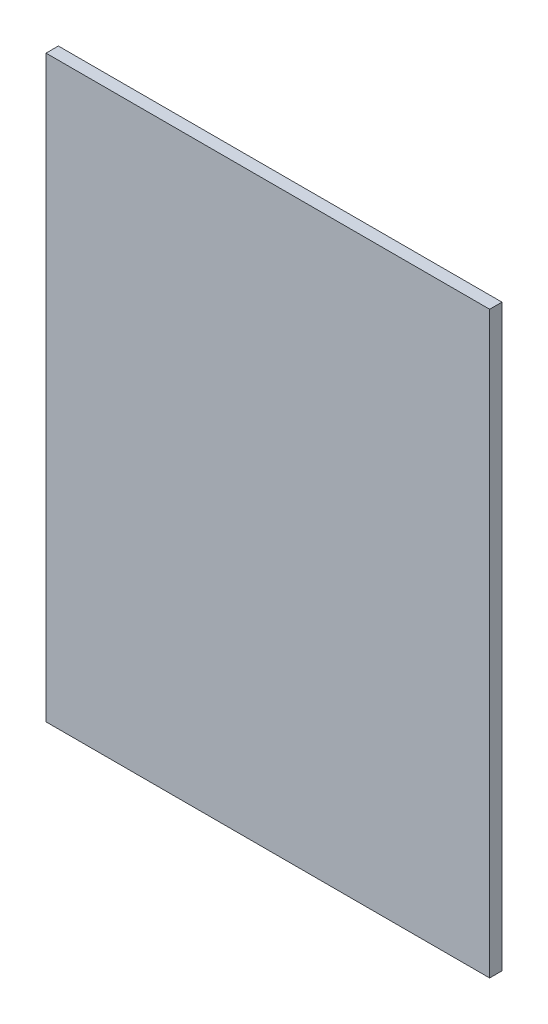
ISO-10303-21;
HEADER;
FILE_DESCRIPTION(('STEP AP214'),'2;1');
FILE_NAME('part.step','',(''),(''),'','','');
FILE_SCHEMA(('AUTOMOTIVE_DESIGN { 1 0 10303 214 1 1 1 1 }'));
ENDSEC;
DATA;
#1=APPLICATION_CONTEXT('core data for automotive mechanical design processes');
#2=APPLICATION_PROTOCOL_DEFINITION('international standard','automotive_design',2000,#1);
#3=PRODUCT_CONTEXT('',#1,'mechanical');
#4=PRODUCT('Part','Part','',(#3));
#5=PRODUCT_RELATED_PRODUCT_CATEGORY('part','',(#4));
#6=PRODUCT_DEFINITION_FORMATION('','',#4);
#7=PRODUCT_DEFINITION_CONTEXT('part definition',#1,'design');
#8=PRODUCT_DEFINITION('design','',#6,#7);
#9=PRODUCT_DEFINITION_SHAPE('','',#8);
#10=(LENGTH_UNIT() NAMED_UNIT(*) SI_UNIT(.MILLI.,.METRE.));
#11=(NAMED_UNIT(*) PLANE_ANGLE_UNIT() SI_UNIT($,.RADIAN.));
#12=(NAMED_UNIT(*) SI_UNIT($,.STERADIAN.) SOLID_ANGLE_UNIT());
#13=UNCERTAINTY_MEASURE_WITH_UNIT(LENGTH_MEASURE(1.E-05),#10,'distance_accuracy_value','');
#14=(GEOMETRIC_REPRESENTATION_CONTEXT(3) GLOBAL_UNCERTAINTY_ASSIGNED_CONTEXT((#13)) GLOBAL_UNIT_ASSIGNED_CONTEXT((#10,
#11,#12)) REPRESENTATION_CONTEXT('',''));
#15=CARTESIAN_POINT('',(0.,0.,0.));
#16=DIRECTION('',(0.,0.,1.));
#17=DIRECTION('',(1.,0.,0.));
#18=AXIS2_PLACEMENT_3D('',#15,#16,#17);
#19=CARTESIAN_POINT('',(0.,0.,1.));
#20=DIRECTION('',(1.,0.,0.));
#21=DIRECTION('',(0.,0.,-1.));
#22=AXIS2_PLACEMENT_3D('',#19,#20,#21);
#23=PLANE('',#22);
#24=DIRECTION('',(0.,-1.,0.));
#25=VECTOR('',#24,1.);
#26=CARTESIAN_POINT('',(0.,0.,0.));
#27=LINE('',#26,#25);
#28=CARTESIAN_POINT('',(0.,47.,0.));
#29=VERTEX_POINT('',#28);
#30=CARTESIAN_POINT('',(0.,0.,0.));
#31=VERTEX_POINT('',#30);
#32=EDGE_CURVE('E96',#29,#31,#27,.T.);
#33=ORIENTED_EDGE('',*,*,#32,.T.);
#34=DIRECTION('',(0.,0.,-1.));
#35=VECTOR('',#34,1.);
#36=CARTESIAN_POINT('',(0.,0.,1.));
#37=LINE('',#36,#35);
#38=CARTESIAN_POINT('',(0.,0.,1.));
#39=VERTEX_POINT('',#38);
#40=EDGE_CURVE('E11',#39,#31,#37,.T.);
#41=ORIENTED_EDGE('',*,*,#40,.F.);
#42=DIRECTION('',(0.,-1.,0.));
#43=VECTOR('',#42,1.);
#44=CARTESIAN_POINT('',(0.,0.,1.));
#45=LINE('',#44,#43);
#46=CARTESIAN_POINT('',(0.,47.,1.));
#47=VERTEX_POINT('',#46);
#48=EDGE_CURVE('E84',#47,#39,#45,.T.);
#49=ORIENTED_EDGE('',*,*,#48,.F.);
#50=DIRECTION('',(0.,0.,-1.));
#51=VECTOR('',#50,1.);
#52=CARTESIAN_POINT('',(0.,47.,1.));
#53=LINE('',#52,#51);
#54=EDGE_CURVE('E92',#47,#29,#53,.T.);
#55=ORIENTED_EDGE('',*,*,#54,.T.);
#56=EDGE_LOOP('',(#33,#41,#49,#55));
#57=FACE_BOUND('',#56,.T.);
#58=ADVANCED_FACE('F33',(#57),#23,.F.);
#59=CARTESIAN_POINT('',(0.,0.,1.));
#60=DIRECTION('',(0.,1.,0.));
#61=DIRECTION('',(0.,0.,1.));
#62=AXIS2_PLACEMENT_3D('',#59,#60,#61);
#63=PLANE('',#62);
#64=DIRECTION('',(1.,0.,0.));
#65=VECTOR('',#64,1.);
#66=CARTESIAN_POINT('',(0.,0.,0.));
#67=LINE('',#66,#65);
#68=CARTESIAN_POINT('',(36.,0.,0.));
#69=VERTEX_POINT('',#68);
#70=EDGE_CURVE('E88',#31,#69,#67,.T.);
#71=ORIENTED_EDGE('',*,*,#70,.T.);
#72=DIRECTION('',(0.,0.,-1.));
#73=VECTOR('',#72,1.);
#74=CARTESIAN_POINT('',(36.,0.,1.));
#75=LINE('',#74,#73);
#76=CARTESIAN_POINT('',(36.,0.,1.));
#77=VERTEX_POINT('',#76);
#78=EDGE_CURVE('E41',#77,#69,#75,.T.);
#79=ORIENTED_EDGE('',*,*,#78,.F.);
#80=DIRECTION('',(1.,0.,0.));
#81=VECTOR('',#80,1.);
#82=CARTESIAN_POINT('',(0.,0.,1.));
#83=LINE('',#82,#81);
#84=EDGE_CURVE('E79',#39,#77,#83,.T.);
#85=ORIENTED_EDGE('',*,*,#84,.F.);
#86=ORIENTED_EDGE('',*,*,#40,.T.);
#87=EDGE_LOOP('',(#71,#79,#85,#86));
#88=FACE_BOUND('',#87,.T.);
#89=ADVANCED_FACE('F87',(#88),#63,.F.);
#90=CARTESIAN_POINT('',(36.,0.,1.));
#91=DIRECTION('',(-1.,0.,0.));
#92=DIRECTION('',(0.,0.,1.));
#93=AXIS2_PLACEMENT_3D('',#90,#91,#92);
#94=PLANE('',#93);
#95=DIRECTION('',(0.,1.,0.));
#96=VECTOR('',#95,1.);
#97=CARTESIAN_POINT('',(36.,0.,0.));
#98=LINE('',#97,#96);
#99=CARTESIAN_POINT('',(36.,47.,0.));
#100=VERTEX_POINT('',#99);
#101=EDGE_CURVE('E66',#69,#100,#98,.T.);
#102=ORIENTED_EDGE('',*,*,#101,.T.);
#103=DIRECTION('',(0.,0.,-1.));
#104=VECTOR('',#103,1.);
#105=CARTESIAN_POINT('',(36.,47.,1.));
#106=LINE('',#105,#104);
#107=CARTESIAN_POINT('',(36.,47.,1.));
#108=VERTEX_POINT('',#107);
#109=EDGE_CURVE('E89',#108,#100,#106,.T.);
#110=ORIENTED_EDGE('',*,*,#109,.F.);
#111=DIRECTION('',(0.,1.,0.));
#112=VECTOR('',#111,1.);
#113=CARTESIAN_POINT('',(36.,0.,1.));
#114=LINE('',#113,#112);
#115=EDGE_CURVE('E82',#77,#108,#114,.T.);
#116=ORIENTED_EDGE('',*,*,#115,.F.);
#117=ORIENTED_EDGE('',*,*,#78,.T.);
#118=EDGE_LOOP('',(#102,#110,#116,#117));
#119=FACE_BOUND('',#118,.T.);
#120=ADVANCED_FACE('F90',(#119),#94,.F.);
#121=CARTESIAN_POINT('',(0.,47.,1.));
#122=DIRECTION('',(0.,-1.,0.));
#123=DIRECTION('',(0.,0.,-1.));
#124=AXIS2_PLACEMENT_3D('',#121,#122,#123);
#125=PLANE('',#124);
#126=DIRECTION('',(-1.,0.,0.));
#127=VECTOR('',#126,1.);
#128=CARTESIAN_POINT('',(0.,47.,0.));
#129=LINE('',#128,#127);
#130=EDGE_CURVE('E72',#100,#29,#129,.T.);
#131=ORIENTED_EDGE('',*,*,#130,.T.);
#132=ORIENTED_EDGE('',*,*,#54,.F.);
#133=DIRECTION('',(-1.,0.,0.));
#134=VECTOR('',#133,1.);
#135=CARTESIAN_POINT('',(0.,47.,1.));
#136=LINE('',#135,#134);
#137=EDGE_CURVE('E49',#108,#47,#136,.T.);
#138=ORIENTED_EDGE('',*,*,#137,.F.);
#139=ORIENTED_EDGE('',*,*,#109,.T.);
#140=EDGE_LOOP('',(#131,#132,#138,#139));
#141=FACE_BOUND('',#140,.T.);
#142=ADVANCED_FACE('F103',(#141),#125,.F.);
#143=CARTESIAN_POINT('',(0.,0.,1.));
#144=DIRECTION('',(0.,0.,-1.));
#145=DIRECTION('',(-1.,0.,0.));
#146=AXIS2_PLACEMENT_3D('',#143,#144,#145);
#147=PLANE('',#146);
#148=ORIENTED_EDGE('',*,*,#48,.T.);
#149=ORIENTED_EDGE('',*,*,#84,.T.);
#150=ORIENTED_EDGE('',*,*,#115,.T.);
#151=ORIENTED_EDGE('',*,*,#137,.T.);
#152=EDGE_LOOP('',(#148,#149,#150,#151));
#153=FACE_BOUND('',#152,.T.);
#154=ADVANCED_FACE('F80',(#153),#147,.F.);
#155=CARTESIAN_POINT('',(0.,0.,0.));
#156=DIRECTION('',(0.,0.,-1.));
#157=DIRECTION('',(-1.,0.,0.));
#158=AXIS2_PLACEMENT_3D('',#155,#156,#157);
#159=PLANE('',#158);
#160=ORIENTED_EDGE('',*,*,#32,.F.);
#161=ORIENTED_EDGE('',*,*,#130,.F.);
#162=ORIENTED_EDGE('',*,*,#101,.F.);
#163=ORIENTED_EDGE('',*,*,#70,.F.);
#164=EDGE_LOOP('',(#160,#161,#162,#163));
#165=FACE_BOUND('',#164,.T.);
#166=ADVANCED_FACE('F106',(#165),#159,.T.);
#167=CLOSED_SHELL('',(#58,#89,#120,#142,#154,#166));
#168=MANIFOLD_SOLID_BREP('B2',#167);
#169=ADVANCED_BREP_SHAPE_REPRESENTATION('',(#18,#168),#14);
#170=SHAPE_DEFINITION_REPRESENTATION(#9,#169);
ENDSEC;
END-ISO-10303-21;
